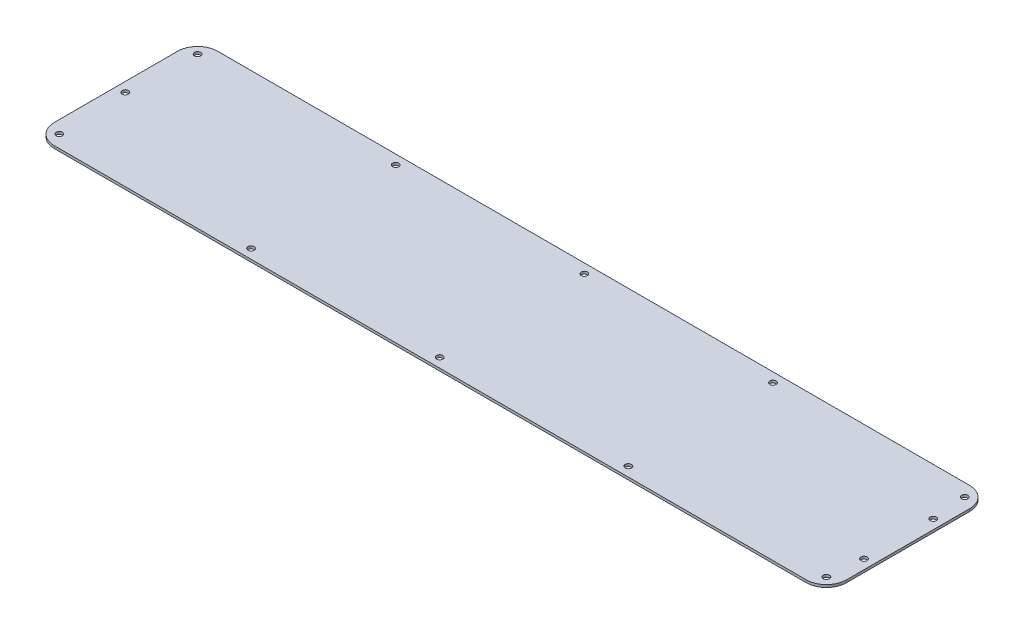
ISO-10303-21;
HEADER;
FILE_DESCRIPTION(('STEP AP214'),'2;1');
FILE_NAME('part.step','',(''),(''),'','','');
FILE_SCHEMA(('AUTOMOTIVE_DESIGN { 1 0 10303 214 1 1 1 1 }'));
ENDSEC;
DATA;
#1=APPLICATION_CONTEXT('core data for automotive mechanical design processes');
#2=APPLICATION_PROTOCOL_DEFINITION('international standard','automotive_design',2000,#1);
#3=PRODUCT_CONTEXT('',#1,'mechanical');
#4=PRODUCT('Part','Part','',(#3));
#5=PRODUCT_RELATED_PRODUCT_CATEGORY('part','',(#4));
#6=PRODUCT_DEFINITION_FORMATION('','',#4);
#7=PRODUCT_DEFINITION_CONTEXT('part definition',#1,'design');
#8=PRODUCT_DEFINITION('design','',#6,#7);
#9=PRODUCT_DEFINITION_SHAPE('','',#8);
#10=(LENGTH_UNIT() NAMED_UNIT(*) SI_UNIT(.MILLI.,.METRE.));
#11=(NAMED_UNIT(*) PLANE_ANGLE_UNIT() SI_UNIT($,.RADIAN.));
#12=(NAMED_UNIT(*) SI_UNIT($,.STERADIAN.) SOLID_ANGLE_UNIT());
#13=UNCERTAINTY_MEASURE_WITH_UNIT(LENGTH_MEASURE(1.E-05),#10,'distance_accuracy_value','');
#14=(GEOMETRIC_REPRESENTATION_CONTEXT(3) GLOBAL_UNCERTAINTY_ASSIGNED_CONTEXT((#13)) GLOBAL_UNIT_ASSIGNED_CONTEXT((#10,
#11,#12)) REPRESENTATION_CONTEXT('',''));
#15=CARTESIAN_POINT('',(0.,0.,0.));
#16=DIRECTION('',(0.,0.,1.));
#17=DIRECTION('',(1.,0.,0.));
#18=AXIS2_PLACEMENT_3D('',#15,#16,#17);
#19=CARTESIAN_POINT('',(315.,2.,-65.));
#20=DIRECTION('',(-1.,0.,0.));
#21=DIRECTION('',(0.,0.,1.));
#22=AXIS2_PLACEMENT_3D('',#19,#20,#21);
#23=PLANE('',#22);
#24=DIRECTION('',(0.,0.,-1.));
#25=VECTOR('',#24,1.);
#26=CARTESIAN_POINT('',(315.,0.,-65.));
#27=LINE('',#26,#25);
#28=CARTESIAN_POINT('',(315.,0.,49.));
#29=VERTEX_POINT('',#28);
#30=CARTESIAN_POINT('',(315.,0.,-49.));
#31=VERTEX_POINT('',#30);
#32=EDGE_CURVE('E132',#29,#31,#27,.T.);
#33=ORIENTED_EDGE('',*,*,#32,.T.);
#34=DIRECTION('',(0.,-1.,0.));
#35=VECTOR('',#34,1.);
#36=CARTESIAN_POINT('',(315.,2.,-49.));
#37=LINE('',#36,#35);
#38=CARTESIAN_POINT('',(315.,2.,-49.));
#39=VERTEX_POINT('',#38);
#40=EDGE_CURVE('E155',#31,#39,#37,.F.);
#41=ORIENTED_EDGE('',*,*,#40,.T.);
#42=DIRECTION('',(0.,0.,-1.));
#43=VECTOR('',#42,1.);
#44=CARTESIAN_POINT('',(315.,2.,-65.));
#45=LINE('',#44,#43);
#46=CARTESIAN_POINT('',(315.,2.,49.));
#47=VERTEX_POINT('',#46);
#48=EDGE_CURVE('E130',#47,#39,#45,.T.);
#49=ORIENTED_EDGE('',*,*,#48,.F.);
#50=DIRECTION('',(0.,-1.,0.));
#51=VECTOR('',#50,1.);
#52=CARTESIAN_POINT('',(315.,2.,49.));
#53=LINE('',#52,#51);
#54=EDGE_CURVE('E152',#47,#29,#53,.T.);
#55=ORIENTED_EDGE('',*,*,#54,.T.);
#56=EDGE_LOOP('',(#33,#41,#49,#55));
#57=FACE_BOUND('',#56,.T.);
#58=ADVANCED_FACE('F37',(#57),#23,.F.);
#59=CARTESIAN_POINT('',(-315.,2.,-65.));
#60=DIRECTION('',(0.,0.,1.));
#61=DIRECTION('',(1.,0.,0.));
#62=AXIS2_PLACEMENT_3D('',#59,#60,#61);
#63=PLANE('',#62);
#64=DIRECTION('',(-1.,0.,0.));
#65=VECTOR('',#64,1.);
#66=CARTESIAN_POINT('',(-315.,0.,-65.));
#67=LINE('',#66,#65);
#68=CARTESIAN_POINT('',(299.,0.,-65.));
#69=VERTEX_POINT('',#68);
#70=CARTESIAN_POINT('',(-299.,0.,-65.));
#71=VERTEX_POINT('',#70);
#72=EDGE_CURVE('E128',#69,#71,#67,.T.);
#73=ORIENTED_EDGE('',*,*,#72,.T.);
#74=DIRECTION('',(0.,-1.,0.));
#75=VECTOR('',#74,1.);
#76=CARTESIAN_POINT('',(-299.,2.,-65.));
#77=LINE('',#76,#75);
#78=CARTESIAN_POINT('',(-299.,2.,-65.));
#79=VERTEX_POINT('',#78);
#80=EDGE_CURVE('E107',#71,#79,#77,.F.);
#81=ORIENTED_EDGE('',*,*,#80,.T.);
#82=DIRECTION('',(-1.,0.,0.));
#83=VECTOR('',#82,1.);
#84=CARTESIAN_POINT('',(-315.,2.,-65.));
#85=LINE('',#84,#83);
#86=CARTESIAN_POINT('',(299.,2.,-65.));
#87=VERTEX_POINT('',#86);
#88=EDGE_CURVE('E171',#87,#79,#85,.T.);
#89=ORIENTED_EDGE('',*,*,#88,.F.);
#90=DIRECTION('',(0.,-1.,0.));
#91=VECTOR('',#90,1.);
#92=CARTESIAN_POINT('',(299.,2.,-65.));
#93=LINE('',#92,#91);
#94=EDGE_CURVE('E112',#87,#69,#93,.T.);
#95=ORIENTED_EDGE('',*,*,#94,.T.);
#96=EDGE_LOOP('',(#73,#81,#89,#95));
#97=FACE_BOUND('',#96,.T.);
#98=ADVANCED_FACE('F292',(#97),#63,.F.);
#99=CARTESIAN_POINT('',(-315.,2.,-65.));
#100=DIRECTION('',(1.,0.,0.));
#101=DIRECTION('',(0.,0.,-1.));
#102=AXIS2_PLACEMENT_3D('',#99,#100,#101);
#103=PLANE('',#102);
#104=DIRECTION('',(0.,0.,1.));
#105=VECTOR('',#104,1.);
#106=CARTESIAN_POINT('',(-315.,2.,-65.));
#107=LINE('',#106,#105);
#108=CARTESIAN_POINT('',(-315.,2.,-49.));
#109=VERTEX_POINT('',#108);
#110=CARTESIAN_POINT('',(-315.,2.,49.));
#111=VERTEX_POINT('',#110);
#112=EDGE_CURVE('E121',#109,#111,#107,.T.);
#113=ORIENTED_EDGE('',*,*,#112,.F.);
#114=DIRECTION('',(0.,-1.,0.));
#115=VECTOR('',#114,1.);
#116=CARTESIAN_POINT('',(-315.,2.,-49.));
#117=LINE('',#116,#115);
#118=CARTESIAN_POINT('',(-315.,0.,-49.));
#119=VERTEX_POINT('',#118);
#120=EDGE_CURVE('E106',#109,#119,#117,.T.);
#121=ORIENTED_EDGE('',*,*,#120,.T.);
#122=DIRECTION('',(0.,0.,1.));
#123=VECTOR('',#122,1.);
#124=CARTESIAN_POINT('',(-315.,0.,-65.));
#125=LINE('',#124,#123);
#126=CARTESIAN_POINT('',(-315.,0.,49.));
#127=VERTEX_POINT('',#126);
#128=EDGE_CURVE('E119',#119,#127,#125,.T.);
#129=ORIENTED_EDGE('',*,*,#128,.T.);
#130=DIRECTION('',(0.,-1.,0.));
#131=VECTOR('',#130,1.);
#132=CARTESIAN_POINT('',(-315.,2.,49.));
#133=LINE('',#132,#131);
#134=EDGE_CURVE('E123',#127,#111,#133,.F.);
#135=ORIENTED_EDGE('',*,*,#134,.T.);
#136=EDGE_LOOP('',(#113,#121,#129,#135));
#137=FACE_BOUND('',#136,.T.);
#138=ADVANCED_FACE('F118',(#137),#103,.F.);
#139=CARTESIAN_POINT('',(-315.,2.,65.));
#140=DIRECTION('',(0.,0.,-1.));
#141=DIRECTION('',(-1.,0.,0.));
#142=AXIS2_PLACEMENT_3D('',#139,#140,#141);
#143=PLANE('',#142);
#144=DIRECTION('',(1.,0.,0.));
#145=VECTOR('',#144,1.);
#146=CARTESIAN_POINT('',(-315.,0.,65.));
#147=LINE('',#146,#145);
#148=CARTESIAN_POINT('',(-299.,0.,65.));
#149=VERTEX_POINT('',#148);
#150=CARTESIAN_POINT('',(299.,0.,65.));
#151=VERTEX_POINT('',#150);
#152=EDGE_CURVE('E127',#149,#151,#147,.T.);
#153=ORIENTED_EDGE('',*,*,#152,.T.);
#154=DIRECTION('',(0.,-1.,0.));
#155=VECTOR('',#154,1.);
#156=CARTESIAN_POINT('',(299.,2.,65.));
#157=LINE('',#156,#155);
#158=CARTESIAN_POINT('',(299.,2.,65.));
#159=VERTEX_POINT('',#158);
#160=EDGE_CURVE('E11',#151,#159,#157,.F.);
#161=ORIENTED_EDGE('',*,*,#160,.T.);
#162=DIRECTION('',(1.,0.,0.));
#163=VECTOR('',#162,1.);
#164=CARTESIAN_POINT('',(-315.,2.,65.));
#165=LINE('',#164,#163);
#166=CARTESIAN_POINT('',(-299.,2.,65.));
#167=VERTEX_POINT('',#166);
#168=EDGE_CURVE('E136',#167,#159,#165,.T.);
#169=ORIENTED_EDGE('',*,*,#168,.F.);
#170=DIRECTION('',(0.,-1.,0.));
#171=VECTOR('',#170,1.);
#172=CARTESIAN_POINT('',(-299.,2.,65.));
#173=LINE('',#172,#171);
#174=EDGE_CURVE('E45',#167,#149,#173,.T.);
#175=ORIENTED_EDGE('',*,*,#174,.T.);
#176=EDGE_LOOP('',(#153,#161,#169,#175));
#177=FACE_BOUND('',#176,.T.);
#178=ADVANCED_FACE('F158',(#177),#143,.F.);
#179=CARTESIAN_POINT('',(0.,2.,0.));
#180=DIRECTION('',(0.,1.,0.));
#181=DIRECTION('',(0.,0.,1.));
#182=AXIS2_PLACEMENT_3D('',#179,#180,#181);
#183=PLANE('',#182);
#184=CARTESIAN_POINT('',(-305.010407640086,2.,-55.0104076400856));
#185=DIRECTION('',(0.,1.,0.));
#186=DIRECTION('',(0.,0.,1.));
#187=AXIS2_PLACEMENT_3D('',#184,#185,#186);
#188=CIRCLE('',#187,2.5);
#189=CARTESIAN_POINT('',(-305.010407640086,2.,-52.5104076400856));
#190=VERTEX_POINT('',#189);
#191=EDGE_CURVE('E257',#190,#190,#188,.T.);
#192=ORIENTED_EDGE('',*,*,#191,.F.);
#193=EDGE_LOOP('',(#192));
#194=FACE_BOUND('',#193,.T.);
#195=CARTESIAN_POINT('',(-150.,2.,-57.5));
#196=DIRECTION('',(0.,1.,0.));
#197=DIRECTION('',(0.,0.,1.));
#198=AXIS2_PLACEMENT_3D('',#195,#196,#197);
#199=CIRCLE('',#198,2.5);
#200=CARTESIAN_POINT('',(-150.,2.,-55.));
#201=VERTEX_POINT('',#200);
#202=EDGE_CURVE('E251',#201,#201,#199,.T.);
#203=ORIENTED_EDGE('',*,*,#202,.F.);
#204=EDGE_LOOP('',(#203));
#205=FACE_BOUND('',#204,.T.);
#206=CARTESIAN_POINT('',(-307.5,2.,0.));
#207=DIRECTION('',(0.,1.,0.));
#208=DIRECTION('',(0.,0.,1.));
#209=AXIS2_PLACEMENT_3D('',#206,#207,#208);
#210=CIRCLE('',#209,2.5);
#211=CARTESIAN_POINT('',(-307.5,2.,2.5));
#212=VERTEX_POINT('',#211);
#213=EDGE_CURVE('E245',#212,#212,#210,.T.);
#214=ORIENTED_EDGE('',*,*,#213,.F.);
#215=EDGE_LOOP('',(#214));
#216=FACE_BOUND('',#215,.T.);
#217=CARTESIAN_POINT('',(-305.010407640086,2.,55.0104076400856));
#218=DIRECTION('',(0.,1.,0.));
#219=DIRECTION('',(0.,0.,1.));
#220=AXIS2_PLACEMENT_3D('',#217,#218,#219);
#221=CIRCLE('',#220,2.5);
#222=CARTESIAN_POINT('',(-305.010407640086,2.,57.5104076400857));
#223=VERTEX_POINT('',#222);
#224=EDGE_CURVE('E239',#223,#223,#221,.T.);
#225=ORIENTED_EDGE('',*,*,#224,.F.);
#226=EDGE_LOOP('',(#225));
#227=FACE_BOUND('',#226,.T.);
#228=CARTESIAN_POINT('',(-150.,2.,57.5));
#229=DIRECTION('',(0.,1.,0.));
#230=DIRECTION('',(0.,0.,1.));
#231=AXIS2_PLACEMENT_3D('',#228,#229,#230);
#232=CIRCLE('',#231,2.5);
#233=CARTESIAN_POINT('',(-150.,2.,60.));
#234=VERTEX_POINT('',#233);
#235=EDGE_CURVE('E233',#234,#234,#232,.T.);
#236=ORIENTED_EDGE('',*,*,#235,.F.);
#237=EDGE_LOOP('',(#236));
#238=FACE_BOUND('',#237,.T.);
#239=CARTESIAN_POINT('',(0.,2.,-57.5));
#240=DIRECTION('',(0.,1.,0.));
#241=DIRECTION('',(0.,0.,1.));
#242=AXIS2_PLACEMENT_3D('',#239,#240,#241);
#243=CIRCLE('',#242,2.5);
#244=CARTESIAN_POINT('',(0.,2.,-55.));
#245=VERTEX_POINT('',#244);
#246=EDGE_CURVE('E227',#245,#245,#243,.T.);
#247=ORIENTED_EDGE('',*,*,#246,.F.);
#248=EDGE_LOOP('',(#247));
#249=FACE_BOUND('',#248,.T.);
#250=CARTESIAN_POINT('',(0.,2.,57.5));
#251=DIRECTION('',(0.,1.,0.));
#252=DIRECTION('',(0.,0.,1.));
#253=AXIS2_PLACEMENT_3D('',#250,#251,#252);
#254=CIRCLE('',#253,2.5);
#255=CARTESIAN_POINT('',(0.,2.,60.));
#256=VERTEX_POINT('',#255);
#257=EDGE_CURVE('E221',#256,#256,#254,.T.);
#258=ORIENTED_EDGE('',*,*,#257,.F.);
#259=EDGE_LOOP('',(#258));
#260=FACE_BOUND('',#259,.T.);
#261=CARTESIAN_POINT('',(150.,2.,57.5));
#262=DIRECTION('',(0.,1.,0.));
#263=DIRECTION('',(0.,0.,1.));
#264=AXIS2_PLACEMENT_3D('',#261,#262,#263);
#265=CIRCLE('',#264,2.5);
#266=CARTESIAN_POINT('',(150.,2.,60.));
#267=VERTEX_POINT('',#266);
#268=EDGE_CURVE('E215',#267,#267,#265,.T.);
#269=ORIENTED_EDGE('',*,*,#268,.F.);
#270=EDGE_LOOP('',(#269));
#271=FACE_BOUND('',#270,.T.);
#272=CARTESIAN_POINT('',(150.,2.,-57.5000000000001));
#273=DIRECTION('',(0.,1.,0.));
#274=DIRECTION('',(0.,0.,1.));
#275=AXIS2_PLACEMENT_3D('',#272,#273,#274);
#276=CIRCLE('',#275,2.5);
#277=CARTESIAN_POINT('',(150.,2.,-55.0000000000001));
#278=VERTEX_POINT('',#277);
#279=EDGE_CURVE('E209',#278,#278,#276,.T.);
#280=ORIENTED_EDGE('',*,*,#279,.F.);
#281=EDGE_LOOP('',(#280));
#282=FACE_BOUND('',#281,.T.);
#283=CARTESIAN_POINT('',(305.010407640086,2.,-55.0104076400856));
#284=DIRECTION('',(0.,1.,0.));
#285=DIRECTION('',(0.,0.,1.));
#286=AXIS2_PLACEMENT_3D('',#283,#284,#285);
#287=CIRCLE('',#286,2.5);
#288=CARTESIAN_POINT('',(305.010407640086,2.,-52.5104076400856));
#289=VERTEX_POINT('',#288);
#290=EDGE_CURVE('E203',#289,#289,#287,.T.);
#291=ORIENTED_EDGE('',*,*,#290,.F.);
#292=EDGE_LOOP('',(#291));
#293=FACE_BOUND('',#292,.T.);
#294=CARTESIAN_POINT('',(305.010407640086,2.,55.0104076400856));
#295=DIRECTION('',(0.,1.,0.));
#296=DIRECTION('',(0.,0.,1.));
#297=AXIS2_PLACEMENT_3D('',#294,#295,#296);
#298=CIRCLE('',#297,2.5);
#299=CARTESIAN_POINT('',(305.010407640086,2.,57.5104076400857));
#300=VERTEX_POINT('',#299);
#301=EDGE_CURVE('E197',#300,#300,#298,.T.);
#302=ORIENTED_EDGE('',*,*,#301,.F.);
#303=EDGE_LOOP('',(#302));
#304=FACE_BOUND('',#303,.T.);
#305=CARTESIAN_POINT('',(307.5,2.,-27.5000000000001));
#306=DIRECTION('',(0.,1.,0.));
#307=DIRECTION('',(0.,0.,1.));
#308=AXIS2_PLACEMENT_3D('',#305,#306,#307);
#309=CIRCLE('',#308,2.5);
#310=CARTESIAN_POINT('',(307.5,2.,-25.0000000000001));
#311=VERTEX_POINT('',#310);
#312=EDGE_CURVE('E189',#311,#311,#309,.T.);
#313=ORIENTED_EDGE('',*,*,#312,.F.);
#314=EDGE_LOOP('',(#313));
#315=FACE_BOUND('',#314,.T.);
#316=CARTESIAN_POINT('',(307.5,2.,27.5));
#317=DIRECTION('',(0.,1.,0.));
#318=DIRECTION('',(0.,0.,1.));
#319=AXIS2_PLACEMENT_3D('',#316,#317,#318);
#320=CIRCLE('',#319,2.5);
#321=CARTESIAN_POINT('',(307.5,2.,30.));
#322=VERTEX_POINT('',#321);
#323=EDGE_CURVE('E181',#322,#322,#320,.T.);
#324=ORIENTED_EDGE('',*,*,#323,.F.);
#325=EDGE_LOOP('',(#324));
#326=FACE_BOUND('',#325,.T.);
#327=ORIENTED_EDGE('',*,*,#88,.T.);
#328=CARTESIAN_POINT('',(-299.,2.,-49.));
#329=DIRECTION('',(0.,1.,0.));
#330=DIRECTION('',(0.,0.,1.));
#331=AXIS2_PLACEMENT_3D('',#328,#329,#330);
#332=CIRCLE('',#331,16.);
#333=EDGE_CURVE('E150',#79,#109,#332,.T.);
#334=ORIENTED_EDGE('',*,*,#333,.T.);
#335=ORIENTED_EDGE('',*,*,#112,.T.);
#336=CARTESIAN_POINT('',(-299.,2.,49.));
#337=DIRECTION('',(0.,1.,0.));
#338=DIRECTION('',(0.,0.,1.));
#339=AXIS2_PLACEMENT_3D('',#336,#337,#338);
#340=CIRCLE('',#339,16.);
#341=EDGE_CURVE('E57',#111,#167,#340,.T.);
#342=ORIENTED_EDGE('',*,*,#341,.T.);
#343=ORIENTED_EDGE('',*,*,#168,.T.);
#344=CARTESIAN_POINT('',(299.,2.,49.));
#345=DIRECTION('',(0.,1.,0.));
#346=DIRECTION('',(0.,0.,1.));
#347=AXIS2_PLACEMENT_3D('',#344,#345,#346);
#348=CIRCLE('',#347,16.);
#349=EDGE_CURVE('E146',#159,#47,#348,.T.);
#350=ORIENTED_EDGE('',*,*,#349,.T.);
#351=ORIENTED_EDGE('',*,*,#48,.T.);
#352=CARTESIAN_POINT('',(299.,2.,-49.));
#353=DIRECTION('',(0.,1.,0.));
#354=DIRECTION('',(0.,0.,1.));
#355=AXIS2_PLACEMENT_3D('',#352,#353,#354);
#356=CIRCLE('',#355,16.);
#357=EDGE_CURVE('E148',#39,#87,#356,.T.);
#358=ORIENTED_EDGE('',*,*,#357,.T.);
#359=EDGE_LOOP('',(#327,#334,#335,#342,#343,#350,#351,#358));
#360=FACE_BOUND('',#359,.T.);
#361=ADVANCED_FACE('F263',(#194,#205,#216,#227,#238,#249,#260,#271,#282,#293,#304,#315,#326,
#360),#183,.T.);
#362=CARTESIAN_POINT('',(0.,0.,0.));
#363=DIRECTION('',(0.,1.,0.));
#364=DIRECTION('',(0.,0.,1.));
#365=AXIS2_PLACEMENT_3D('',#362,#363,#364);
#366=PLANE('',#365);
#367=CARTESIAN_POINT('',(-305.010407640086,0.,-55.0104076400856));
#368=DIRECTION('',(0.,1.,0.));
#369=DIRECTION('',(0.,0.,1.));
#370=AXIS2_PLACEMENT_3D('',#367,#368,#369);
#371=CIRCLE('',#370,2.5);
#372=CARTESIAN_POINT('',(-305.010407640086,0.,-52.5104076400856));
#373=VERTEX_POINT('',#372);
#374=EDGE_CURVE('E254',#373,#373,#371,.T.);
#375=ORIENTED_EDGE('',*,*,#374,.T.);
#376=EDGE_LOOP('',(#375));
#377=FACE_BOUND('',#376,.T.);
#378=CARTESIAN_POINT('',(-150.,0.,-57.5));
#379=DIRECTION('',(0.,1.,0.));
#380=DIRECTION('',(0.,0.,1.));
#381=AXIS2_PLACEMENT_3D('',#378,#379,#380);
#382=CIRCLE('',#381,2.5);
#383=CARTESIAN_POINT('',(-150.,0.,-55.));
#384=VERTEX_POINT('',#383);
#385=EDGE_CURVE('E248',#384,#384,#382,.T.);
#386=ORIENTED_EDGE('',*,*,#385,.T.);
#387=EDGE_LOOP('',(#386));
#388=FACE_BOUND('',#387,.T.);
#389=CARTESIAN_POINT('',(-307.5,0.,0.));
#390=DIRECTION('',(0.,1.,0.));
#391=DIRECTION('',(0.,0.,1.));
#392=AXIS2_PLACEMENT_3D('',#389,#390,#391);
#393=CIRCLE('',#392,2.5);
#394=CARTESIAN_POINT('',(-307.5,0.,2.5));
#395=VERTEX_POINT('',#394);
#396=EDGE_CURVE('E242',#395,#395,#393,.T.);
#397=ORIENTED_EDGE('',*,*,#396,.T.);
#398=EDGE_LOOP('',(#397));
#399=FACE_BOUND('',#398,.T.);
#400=CARTESIAN_POINT('',(-305.010407640086,0.,55.0104076400856));
#401=DIRECTION('',(0.,1.,0.));
#402=DIRECTION('',(0.,0.,1.));
#403=AXIS2_PLACEMENT_3D('',#400,#401,#402);
#404=CIRCLE('',#403,2.5);
#405=CARTESIAN_POINT('',(-305.010407640086,0.,57.5104076400857));
#406=VERTEX_POINT('',#405);
#407=EDGE_CURVE('E236',#406,#406,#404,.T.);
#408=ORIENTED_EDGE('',*,*,#407,.T.);
#409=EDGE_LOOP('',(#408));
#410=FACE_BOUND('',#409,.T.);
#411=CARTESIAN_POINT('',(-150.,0.,57.5));
#412=DIRECTION('',(0.,1.,0.));
#413=DIRECTION('',(0.,0.,1.));
#414=AXIS2_PLACEMENT_3D('',#411,#412,#413);
#415=CIRCLE('',#414,2.5);
#416=CARTESIAN_POINT('',(-150.,0.,60.));
#417=VERTEX_POINT('',#416);
#418=EDGE_CURVE('E230',#417,#417,#415,.T.);
#419=ORIENTED_EDGE('',*,*,#418,.T.);
#420=EDGE_LOOP('',(#419));
#421=FACE_BOUND('',#420,.T.);
#422=CARTESIAN_POINT('',(0.,0.,-57.5));
#423=DIRECTION('',(0.,1.,0.));
#424=DIRECTION('',(0.,0.,1.));
#425=AXIS2_PLACEMENT_3D('',#422,#423,#424);
#426=CIRCLE('',#425,2.5);
#427=CARTESIAN_POINT('',(0.,0.,-55.));
#428=VERTEX_POINT('',#427);
#429=EDGE_CURVE('E224',#428,#428,#426,.T.);
#430=ORIENTED_EDGE('',*,*,#429,.T.);
#431=EDGE_LOOP('',(#430));
#432=FACE_BOUND('',#431,.T.);
#433=CARTESIAN_POINT('',(0.,0.,57.5));
#434=DIRECTION('',(0.,1.,0.));
#435=DIRECTION('',(0.,0.,1.));
#436=AXIS2_PLACEMENT_3D('',#433,#434,#435);
#437=CIRCLE('',#436,2.5);
#438=CARTESIAN_POINT('',(0.,0.,60.));
#439=VERTEX_POINT('',#438);
#440=EDGE_CURVE('E218',#439,#439,#437,.T.);
#441=ORIENTED_EDGE('',*,*,#440,.T.);
#442=EDGE_LOOP('',(#441));
#443=FACE_BOUND('',#442,.T.);
#444=CARTESIAN_POINT('',(150.,0.,57.5));
#445=DIRECTION('',(0.,1.,0.));
#446=DIRECTION('',(0.,0.,1.));
#447=AXIS2_PLACEMENT_3D('',#444,#445,#446);
#448=CIRCLE('',#447,2.5);
#449=CARTESIAN_POINT('',(150.,0.,60.));
#450=VERTEX_POINT('',#449);
#451=EDGE_CURVE('E212',#450,#450,#448,.T.);
#452=ORIENTED_EDGE('',*,*,#451,.T.);
#453=EDGE_LOOP('',(#452));
#454=FACE_BOUND('',#453,.T.);
#455=CARTESIAN_POINT('',(150.,0.,-57.5000000000001));
#456=DIRECTION('',(0.,1.,0.));
#457=DIRECTION('',(0.,0.,1.));
#458=AXIS2_PLACEMENT_3D('',#455,#456,#457);
#459=CIRCLE('',#458,2.5);
#460=CARTESIAN_POINT('',(150.,0.,-55.0000000000001));
#461=VERTEX_POINT('',#460);
#462=EDGE_CURVE('E206',#461,#461,#459,.T.);
#463=ORIENTED_EDGE('',*,*,#462,.T.);
#464=EDGE_LOOP('',(#463));
#465=FACE_BOUND('',#464,.T.);
#466=CARTESIAN_POINT('',(305.010407640086,0.,-55.0104076400856));
#467=DIRECTION('',(0.,1.,0.));
#468=DIRECTION('',(0.,0.,1.));
#469=AXIS2_PLACEMENT_3D('',#466,#467,#468);
#470=CIRCLE('',#469,2.5);
#471=CARTESIAN_POINT('',(305.010407640086,0.,-52.5104076400856));
#472=VERTEX_POINT('',#471);
#473=EDGE_CURVE('E200',#472,#472,#470,.T.);
#474=ORIENTED_EDGE('',*,*,#473,.T.);
#475=EDGE_LOOP('',(#474));
#476=FACE_BOUND('',#475,.T.);
#477=CARTESIAN_POINT('',(305.010407640086,0.,55.0104076400856));
#478=DIRECTION('',(0.,1.,0.));
#479=DIRECTION('',(0.,0.,1.));
#480=AXIS2_PLACEMENT_3D('',#477,#478,#479);
#481=CIRCLE('',#480,2.5);
#482=CARTESIAN_POINT('',(305.010407640086,0.,57.5104076400857));
#483=VERTEX_POINT('',#482);
#484=EDGE_CURVE('E194',#483,#483,#481,.T.);
#485=ORIENTED_EDGE('',*,*,#484,.T.);
#486=EDGE_LOOP('',(#485));
#487=FACE_BOUND('',#486,.T.);
#488=CARTESIAN_POINT('',(307.5,0.,-27.5000000000001));
#489=DIRECTION('',(0.,1.,0.));
#490=DIRECTION('',(0.,0.,1.));
#491=AXIS2_PLACEMENT_3D('',#488,#489,#490);
#492=CIRCLE('',#491,2.5);
#493=CARTESIAN_POINT('',(307.5,0.,-25.0000000000001));
#494=VERTEX_POINT('',#493);
#495=EDGE_CURVE('E185',#494,#494,#492,.T.);
#496=ORIENTED_EDGE('',*,*,#495,.T.);
#497=EDGE_LOOP('',(#496));
#498=FACE_BOUND('',#497,.T.);
#499=CARTESIAN_POINT('',(307.5,0.,27.5));
#500=DIRECTION('',(0.,1.,0.));
#501=DIRECTION('',(0.,0.,1.));
#502=AXIS2_PLACEMENT_3D('',#499,#500,#501);
#503=CIRCLE('',#502,2.5);
#504=CARTESIAN_POINT('',(307.5,0.,30.));
#505=VERTEX_POINT('',#504);
#506=EDGE_CURVE('E176',#505,#505,#503,.T.);
#507=ORIENTED_EDGE('',*,*,#506,.T.);
#508=EDGE_LOOP('',(#507));
#509=FACE_BOUND('',#508,.T.);
#510=ORIENTED_EDGE('',*,*,#128,.F.);
#511=CARTESIAN_POINT('',(-299.,0.,-49.));
#512=DIRECTION('',(0.,1.,0.));
#513=DIRECTION('',(0.,0.,1.));
#514=AXIS2_PLACEMENT_3D('',#511,#512,#513);
#515=CIRCLE('',#514,16.);
#516=EDGE_CURVE('E102',#119,#71,#515,.F.);
#517=ORIENTED_EDGE('',*,*,#516,.T.);
#518=ORIENTED_EDGE('',*,*,#72,.F.);
#519=CARTESIAN_POINT('',(299.,0.,-49.));
#520=DIRECTION('',(0.,1.,0.));
#521=DIRECTION('',(0.,0.,1.));
#522=AXIS2_PLACEMENT_3D('',#519,#520,#521);
#523=CIRCLE('',#522,16.);
#524=EDGE_CURVE('E113',#69,#31,#523,.F.);
#525=ORIENTED_EDGE('',*,*,#524,.T.);
#526=ORIENTED_EDGE('',*,*,#32,.F.);
#527=CARTESIAN_POINT('',(299.,0.,49.));
#528=DIRECTION('',(0.,1.,0.));
#529=DIRECTION('',(0.,0.,1.));
#530=AXIS2_PLACEMENT_3D('',#527,#528,#529);
#531=CIRCLE('',#530,16.);
#532=EDGE_CURVE('E139',#29,#151,#531,.F.);
#533=ORIENTED_EDGE('',*,*,#532,.T.);
#534=ORIENTED_EDGE('',*,*,#152,.F.);
#535=CARTESIAN_POINT('',(-299.,0.,49.));
#536=DIRECTION('',(0.,1.,0.));
#537=DIRECTION('',(0.,0.,1.));
#538=AXIS2_PLACEMENT_3D('',#535,#536,#537);
#539=CIRCLE('',#538,16.);
#540=EDGE_CURVE('E122',#149,#127,#539,.F.);
#541=ORIENTED_EDGE('',*,*,#540,.T.);
#542=EDGE_LOOP('',(#510,#517,#518,#525,#526,#533,#534,#541));
#543=FACE_BOUND('',#542,.T.);
#544=ADVANCED_FACE('F125',(#377,#388,#399,#410,#421,#432,#443,#454,#465,#476,#487,#498,#509,
#543),#366,.F.);
#545=CARTESIAN_POINT('',(-299.,2.,-49.));
#546=DIRECTION('',(0.,-1.,0.));
#547=DIRECTION('',(0.,0.,-1.));
#548=AXIS2_PLACEMENT_3D('',#545,#546,#547);
#549=CYLINDRICAL_SURFACE('',#548,16.);
#550=ORIENTED_EDGE('',*,*,#333,.F.);
#551=ORIENTED_EDGE('',*,*,#80,.F.);
#552=ORIENTED_EDGE('',*,*,#516,.F.);
#553=ORIENTED_EDGE('',*,*,#120,.F.);
#554=EDGE_LOOP('',(#550,#551,#552,#553));
#555=FACE_BOUND('',#554,.T.);
#556=ADVANCED_FACE('F105',(#555),#549,.T.);
#557=CARTESIAN_POINT('',(299.,2.,-49.));
#558=DIRECTION('',(0.,-1.,0.));
#559=DIRECTION('',(0.,0.,-1.));
#560=AXIS2_PLACEMENT_3D('',#557,#558,#559);
#561=CYLINDRICAL_SURFACE('',#560,16.);
#562=ORIENTED_EDGE('',*,*,#357,.F.);
#563=ORIENTED_EDGE('',*,*,#40,.F.);
#564=ORIENTED_EDGE('',*,*,#524,.F.);
#565=ORIENTED_EDGE('',*,*,#94,.F.);
#566=EDGE_LOOP('',(#562,#563,#564,#565));
#567=FACE_BOUND('',#566,.T.);
#568=ADVANCED_FACE('F294',(#567),#561,.T.);
#569=CARTESIAN_POINT('',(299.,2.,49.));
#570=DIRECTION('',(0.,-1.,0.));
#571=DIRECTION('',(0.,0.,-1.));
#572=AXIS2_PLACEMENT_3D('',#569,#570,#571);
#573=CYLINDRICAL_SURFACE('',#572,16.);
#574=ORIENTED_EDGE('',*,*,#349,.F.);
#575=ORIENTED_EDGE('',*,*,#160,.F.);
#576=ORIENTED_EDGE('',*,*,#532,.F.);
#577=ORIENTED_EDGE('',*,*,#54,.F.);
#578=EDGE_LOOP('',(#574,#575,#576,#577));
#579=FACE_BOUND('',#578,.T.);
#580=ADVANCED_FACE('F165',(#579),#573,.T.);
#581=CARTESIAN_POINT('',(-299.,2.,49.));
#582=DIRECTION('',(0.,-1.,0.));
#583=DIRECTION('',(0.,0.,-1.));
#584=AXIS2_PLACEMENT_3D('',#581,#582,#583);
#585=CYLINDRICAL_SURFACE('',#584,16.);
#586=ORIENTED_EDGE('',*,*,#341,.F.);
#587=ORIENTED_EDGE('',*,*,#134,.F.);
#588=ORIENTED_EDGE('',*,*,#540,.F.);
#589=ORIENTED_EDGE('',*,*,#174,.F.);
#590=EDGE_LOOP('',(#586,#587,#588,#589));
#591=FACE_BOUND('',#590,.T.);
#592=ADVANCED_FACE('F39',(#591),#585,.T.);
#593=CARTESIAN_POINT('',(307.5,2.,27.5));
#594=DIRECTION('',(0.,1.,0.));
#595=DIRECTION('',(0.,0.,1.));
#596=AXIS2_PLACEMENT_3D('',#593,#594,#595);
#597=CYLINDRICAL_SURFACE('',#596,2.5);
#598=ORIENTED_EDGE('',*,*,#506,.F.);
#599=EDGE_LOOP('',(#598));
#600=FACE_BOUND('',#599,.T.);
#601=ORIENTED_EDGE('',*,*,#323,.T.);
#602=EDGE_LOOP('',(#601));
#603=FACE_BOUND('',#602,.T.);
#604=ADVANCED_FACE('F316',(#600,#603),#597,.F.);
#605=CARTESIAN_POINT('',(307.5,2.,-27.5000000000001));
#606=DIRECTION('',(0.,1.,0.));
#607=DIRECTION('',(0.,0.,1.));
#608=AXIS2_PLACEMENT_3D('',#605,#606,#607);
#609=CYLINDRICAL_SURFACE('',#608,2.5);
#610=ORIENTED_EDGE('',*,*,#495,.F.);
#611=EDGE_LOOP('',(#610));
#612=FACE_BOUND('',#611,.T.);
#613=ORIENTED_EDGE('',*,*,#312,.T.);
#614=EDGE_LOOP('',(#613));
#615=FACE_BOUND('',#614,.T.);
#616=ADVANCED_FACE('F319',(#612,#615),#609,.F.);
#617=CARTESIAN_POINT('',(305.010407640086,2.,55.0104076400856));
#618=DIRECTION('',(0.,1.,0.));
#619=DIRECTION('',(0.,0.,1.));
#620=AXIS2_PLACEMENT_3D('',#617,#618,#619);
#621=CYLINDRICAL_SURFACE('',#620,2.5);
#622=ORIENTED_EDGE('',*,*,#484,.F.);
#623=EDGE_LOOP('',(#622));
#624=FACE_BOUND('',#623,.T.);
#625=ORIENTED_EDGE('',*,*,#301,.T.);
#626=EDGE_LOOP('',(#625));
#627=FACE_BOUND('',#626,.T.);
#628=ADVANCED_FACE('F323',(#624,#627),#621,.F.);
#629=CARTESIAN_POINT('',(305.010407640086,2.,-55.0104076400856));
#630=DIRECTION('',(0.,1.,0.));
#631=DIRECTION('',(0.,0.,1.));
#632=AXIS2_PLACEMENT_3D('',#629,#630,#631);
#633=CYLINDRICAL_SURFACE('',#632,2.5);
#634=ORIENTED_EDGE('',*,*,#473,.F.);
#635=EDGE_LOOP('',(#634));
#636=FACE_BOUND('',#635,.T.);
#637=ORIENTED_EDGE('',*,*,#290,.T.);
#638=EDGE_LOOP('',(#637));
#639=FACE_BOUND('',#638,.T.);
#640=ADVANCED_FACE('F327',(#636,#639),#633,.F.);
#641=CARTESIAN_POINT('',(150.,2.,-57.5000000000001));
#642=DIRECTION('',(0.,1.,0.));
#643=DIRECTION('',(0.,0.,1.));
#644=AXIS2_PLACEMENT_3D('',#641,#642,#643);
#645=CYLINDRICAL_SURFACE('',#644,2.5);
#646=ORIENTED_EDGE('',*,*,#462,.F.);
#647=EDGE_LOOP('',(#646));
#648=FACE_BOUND('',#647,.T.);
#649=ORIENTED_EDGE('',*,*,#279,.T.);
#650=EDGE_LOOP('',(#649));
#651=FACE_BOUND('',#650,.T.);
#652=ADVANCED_FACE('F331',(#648,#651),#645,.F.);
#653=CARTESIAN_POINT('',(150.,2.,57.5));
#654=DIRECTION('',(0.,1.,0.));
#655=DIRECTION('',(0.,0.,1.));
#656=AXIS2_PLACEMENT_3D('',#653,#654,#655);
#657=CYLINDRICAL_SURFACE('',#656,2.5);
#658=ORIENTED_EDGE('',*,*,#451,.F.);
#659=EDGE_LOOP('',(#658));
#660=FACE_BOUND('',#659,.T.);
#661=ORIENTED_EDGE('',*,*,#268,.T.);
#662=EDGE_LOOP('',(#661));
#663=FACE_BOUND('',#662,.T.);
#664=ADVANCED_FACE('F335',(#660,#663),#657,.F.);
#665=CARTESIAN_POINT('',(0.,2.,57.5));
#666=DIRECTION('',(0.,1.,0.));
#667=DIRECTION('',(0.,0.,1.));
#668=AXIS2_PLACEMENT_3D('',#665,#666,#667);
#669=CYLINDRICAL_SURFACE('',#668,2.5);
#670=ORIENTED_EDGE('',*,*,#440,.F.);
#671=EDGE_LOOP('',(#670));
#672=FACE_BOUND('',#671,.T.);
#673=ORIENTED_EDGE('',*,*,#257,.T.);
#674=EDGE_LOOP('',(#673));
#675=FACE_BOUND('',#674,.T.);
#676=ADVANCED_FACE('F339',(#672,#675),#669,.F.);
#677=CARTESIAN_POINT('',(0.,2.,-57.5));
#678=DIRECTION('',(0.,1.,0.));
#679=DIRECTION('',(0.,0.,1.));
#680=AXIS2_PLACEMENT_3D('',#677,#678,#679);
#681=CYLINDRICAL_SURFACE('',#680,2.5);
#682=ORIENTED_EDGE('',*,*,#429,.F.);
#683=EDGE_LOOP('',(#682));
#684=FACE_BOUND('',#683,.T.);
#685=ORIENTED_EDGE('',*,*,#246,.T.);
#686=EDGE_LOOP('',(#685));
#687=FACE_BOUND('',#686,.T.);
#688=ADVANCED_FACE('F343',(#684,#687),#681,.F.);
#689=CARTESIAN_POINT('',(-150.,2.,57.5));
#690=DIRECTION('',(0.,1.,0.));
#691=DIRECTION('',(0.,0.,1.));
#692=AXIS2_PLACEMENT_3D('',#689,#690,#691);
#693=CYLINDRICAL_SURFACE('',#692,2.5);
#694=ORIENTED_EDGE('',*,*,#418,.F.);
#695=EDGE_LOOP('',(#694));
#696=FACE_BOUND('',#695,.T.);
#697=ORIENTED_EDGE('',*,*,#235,.T.);
#698=EDGE_LOOP('',(#697));
#699=FACE_BOUND('',#698,.T.);
#700=ADVANCED_FACE('F347',(#696,#699),#693,.F.);
#701=CARTESIAN_POINT('',(-305.010407640086,2.,55.0104076400856));
#702=DIRECTION('',(0.,1.,0.));
#703=DIRECTION('',(0.,0.,1.));
#704=AXIS2_PLACEMENT_3D('',#701,#702,#703);
#705=CYLINDRICAL_SURFACE('',#704,2.5);
#706=ORIENTED_EDGE('',*,*,#407,.F.);
#707=EDGE_LOOP('',(#706));
#708=FACE_BOUND('',#707,.T.);
#709=ORIENTED_EDGE('',*,*,#224,.T.);
#710=EDGE_LOOP('',(#709));
#711=FACE_BOUND('',#710,.T.);
#712=ADVANCED_FACE('F351',(#708,#711),#705,.F.);
#713=CARTESIAN_POINT('',(-307.5,2.,0.));
#714=DIRECTION('',(0.,1.,0.));
#715=DIRECTION('',(0.,0.,1.));
#716=AXIS2_PLACEMENT_3D('',#713,#714,#715);
#717=CYLINDRICAL_SURFACE('',#716,2.5);
#718=ORIENTED_EDGE('',*,*,#396,.F.);
#719=EDGE_LOOP('',(#718));
#720=FACE_BOUND('',#719,.T.);
#721=ORIENTED_EDGE('',*,*,#213,.T.);
#722=EDGE_LOOP('',(#721));
#723=FACE_BOUND('',#722,.T.);
#724=ADVANCED_FACE('F355',(#720,#723),#717,.F.);
#725=CARTESIAN_POINT('',(-150.,2.,-57.5));
#726=DIRECTION('',(0.,1.,0.));
#727=DIRECTION('',(0.,0.,1.));
#728=AXIS2_PLACEMENT_3D('',#725,#726,#727);
#729=CYLINDRICAL_SURFACE('',#728,2.5);
#730=ORIENTED_EDGE('',*,*,#385,.F.);
#731=EDGE_LOOP('',(#730));
#732=FACE_BOUND('',#731,.T.);
#733=ORIENTED_EDGE('',*,*,#202,.T.);
#734=EDGE_LOOP('',(#733));
#735=FACE_BOUND('',#734,.T.);
#736=ADVANCED_FACE('F359',(#732,#735),#729,.F.);
#737=CARTESIAN_POINT('',(-305.010407640086,2.,-55.0104076400856));
#738=DIRECTION('',(0.,1.,0.));
#739=DIRECTION('',(0.,0.,1.));
#740=AXIS2_PLACEMENT_3D('',#737,#738,#739);
#741=CYLINDRICAL_SURFACE('',#740,2.5);
#742=ORIENTED_EDGE('',*,*,#374,.F.);
#743=EDGE_LOOP('',(#742));
#744=FACE_BOUND('',#743,.T.);
#745=ORIENTED_EDGE('',*,*,#191,.T.);
#746=EDGE_LOOP('',(#745));
#747=FACE_BOUND('',#746,.T.);
#748=ADVANCED_FACE('F261',(#744,#747),#741,.F.);
#749=CLOSED_SHELL('',(#58,#98,#138,#178,#361,#544,#556,#568,#580,#592,#604,#616,#628,#640,#652,
#664,#676,#688,#700,#712,#724,#736,#748));
#750=MANIFOLD_SOLID_BREP('B2',#749);
#751=ADVANCED_BREP_SHAPE_REPRESENTATION('',(#18,#750),#14);
#752=SHAPE_DEFINITION_REPRESENTATION(#9,#751);
ENDSEC;
END-ISO-10303-21;
